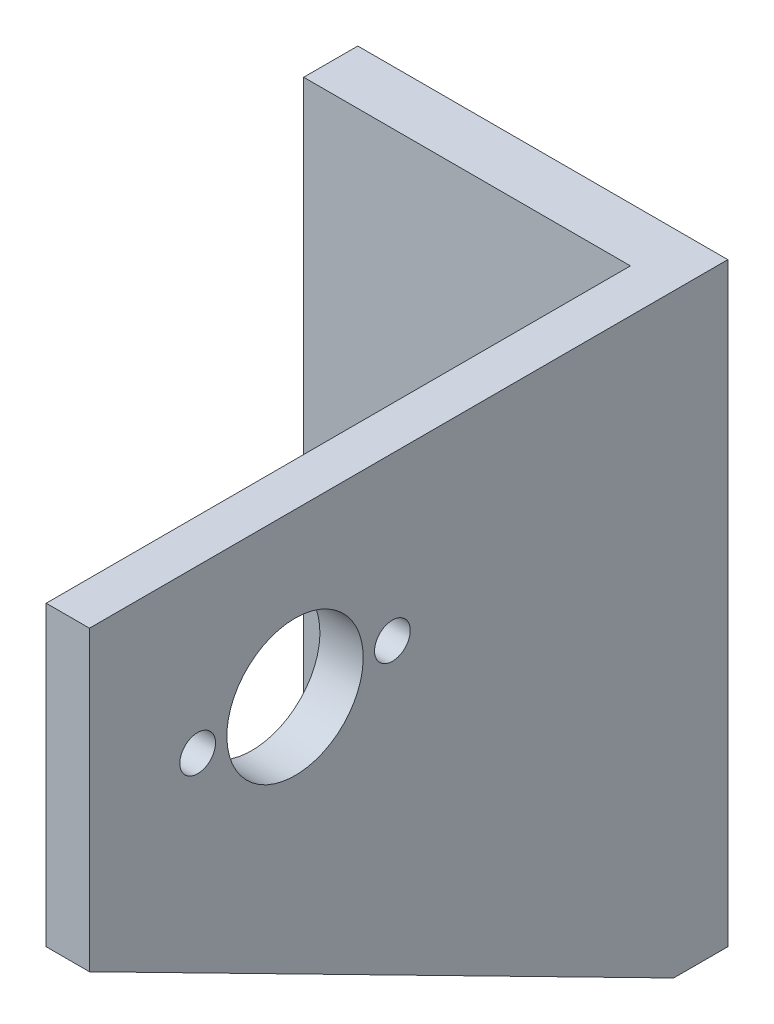
ISO-10303-21;
HEADER;
FILE_DESCRIPTION(('STEP AP214'),'2;1');
FILE_NAME('part.step','',(''),(''),'','','');
FILE_SCHEMA(('AUTOMOTIVE_DESIGN { 1 0 10303 214 1 1 1 1 }'));
ENDSEC;
DATA;
#1=APPLICATION_CONTEXT('core data for automotive mechanical design processes');
#2=APPLICATION_PROTOCOL_DEFINITION('international standard','automotive_design',2000,#1);
#3=PRODUCT_CONTEXT('',#1,'mechanical');
#4=PRODUCT('Part','Part','',(#3));
#5=PRODUCT_RELATED_PRODUCT_CATEGORY('part','',(#4));
#6=PRODUCT_DEFINITION_FORMATION('','',#4);
#7=PRODUCT_DEFINITION_CONTEXT('part definition',#1,'design');
#8=PRODUCT_DEFINITION('design','',#6,#7);
#9=PRODUCT_DEFINITION_SHAPE('','',#8);
#10=(LENGTH_UNIT() NAMED_UNIT(*) SI_UNIT(.MILLI.,.METRE.));
#11=(NAMED_UNIT(*) PLANE_ANGLE_UNIT() SI_UNIT($,.RADIAN.));
#12=(NAMED_UNIT(*) SI_UNIT($,.STERADIAN.) SOLID_ANGLE_UNIT());
#13=UNCERTAINTY_MEASURE_WITH_UNIT(LENGTH_MEASURE(1.E-05),#10,'distance_accuracy_value','');
#14=(GEOMETRIC_REPRESENTATION_CONTEXT(3) GLOBAL_UNCERTAINTY_ASSIGNED_CONTEXT((#13)) GLOBAL_UNIT_ASSIGNED_CONTEXT((#10,
#11,#12)) REPRESENTATION_CONTEXT('',''));
#15=CARTESIAN_POINT('',(0.,0.,0.));
#16=DIRECTION('',(0.,0.,1.));
#17=DIRECTION('',(1.,0.,0.));
#18=AXIS2_PLACEMENT_3D('',#15,#16,#17);
#19=CARTESIAN_POINT('',(18.6,0.,5.));
#20=DIRECTION('',(1.,0.,0.));
#21=DIRECTION('',(0.,1.,0.));
#22=AXIS2_PLACEMENT_3D('',#19,#20,#21);
#23=PLANE('',#22);
#24=CARTESIAN_POINT('',(18.6,20.,31.));
#25=DIRECTION('',(1.,0.,0.));
#26=DIRECTION('',(0.,1.,0.));
#27=AXIS2_PLACEMENT_3D('',#24,#25,#26);
#28=CIRCLE('',#27,1.65);
#29=CARTESIAN_POINT('',(18.6,21.65,31.));
#30=VERTEX_POINT('',#29);
#31=EDGE_CURVE('E176',#30,#30,#28,.F.);
#32=ORIENTED_EDGE('',*,*,#31,.T.);
#33=EDGE_LOOP('',(#32));
#34=FACE_BOUND('',#33,.T.);
#35=CARTESIAN_POINT('',(18.6,20.,40.));
#36=DIRECTION('',(1.,0.,0.));
#37=DIRECTION('',(0.,1.,0.));
#38=AXIS2_PLACEMENT_3D('',#35,#36,#37);
#39=CIRCLE('',#38,6.3);
#40=CARTESIAN_POINT('',(18.6,26.3,40.));
#41=VERTEX_POINT('',#40);
#42=EDGE_CURVE('E166',#41,#41,#39,.F.);
#43=ORIENTED_EDGE('',*,*,#42,.T.);
#44=EDGE_LOOP('',(#43));
#45=FACE_BOUND('',#44,.T.);
#46=CARTESIAN_POINT('',(18.6,20.,49.));
#47=DIRECTION('',(1.,0.,0.));
#48=DIRECTION('',(0.,1.,0.));
#49=AXIS2_PLACEMENT_3D('',#46,#47,#48);
#50=CIRCLE('',#49,1.65);
#51=CARTESIAN_POINT('',(18.6,21.65,49.));
#52=VERTEX_POINT('',#51);
#53=EDGE_CURVE('E163',#52,#52,#50,.F.);
#54=ORIENTED_EDGE('',*,*,#53,.T.);
#55=EDGE_LOOP('',(#54));
#56=FACE_BOUND('',#55,.T.);
#57=DIRECTION('',(0.,0.453802176068411,0.891102454825243));
#58=VECTOR('',#57,1.);
#59=CARTESIAN_POINT('',(18.6,-15.8812716999115,13.087684661992));
#60=LINE('',#59,#58);
#61=CARTESIAN_POINT('',(18.6,-20.,5.));
#62=VERTEX_POINT('',#61);
#63=CARTESIAN_POINT('',(18.6,7.5,59.));
#64=VERTEX_POINT('',#63);
#65=EDGE_CURVE('E52',#62,#64,#60,.T.);
#66=ORIENTED_EDGE('',*,*,#65,.F.);
#67=DIRECTION('',(0.,0.,-1.));
#68=VECTOR('',#67,1.);
#69=CARTESIAN_POINT('',(18.6,-20.,5.));
#70=LINE('',#69,#68);
#71=CARTESIAN_POINT('',(18.6,-20.,0.));
#72=VERTEX_POINT('',#71);
#73=EDGE_CURVE('E135',#62,#72,#70,.T.);
#74=ORIENTED_EDGE('',*,*,#73,.T.);
#75=DIRECTION('',(0.,-1.,0.));
#76=VECTOR('',#75,1.);
#77=CARTESIAN_POINT('',(18.6,0.,0.));
#78=LINE('',#77,#76);
#79=CARTESIAN_POINT('',(18.6,35.,0.));
#80=VERTEX_POINT('',#79);
#81=EDGE_CURVE('E118',#80,#72,#78,.T.);
#82=ORIENTED_EDGE('',*,*,#81,.F.);
#83=DIRECTION('',(0.,0.,-1.));
#84=VECTOR('',#83,1.);
#85=CARTESIAN_POINT('',(18.6,35.,5.));
#86=LINE('',#85,#84);
#87=CARTESIAN_POINT('',(18.6,35.,59.));
#88=VERTEX_POINT('',#87);
#89=EDGE_CURVE('E45',#88,#80,#86,.T.);
#90=ORIENTED_EDGE('',*,*,#89,.F.);
#91=DIRECTION('',(0.,1.,0.));
#92=VECTOR('',#91,1.);
#93=CARTESIAN_POINT('',(18.6,35.,59.));
#94=LINE('',#93,#92);
#95=EDGE_CURVE('E109',#64,#88,#94,.T.);
#96=ORIENTED_EDGE('',*,*,#95,.F.);
#97=EDGE_LOOP('',(#66,#74,#82,#90,#96));
#98=FACE_BOUND('',#97,.T.);
#99=ADVANCED_FACE('F37',(#34,#45,#56,#98),#23,.T.);
#100=CARTESIAN_POINT('',(0.,35.,5.));
#101=DIRECTION('',(0.,-1.,0.));
#102=DIRECTION('',(1.,0.,0.));
#103=AXIS2_PLACEMENT_3D('',#100,#101,#102);
#104=PLANE('',#103);
#105=DIRECTION('',(-1.,0.,0.));
#106=VECTOR('',#105,1.);
#107=CARTESIAN_POINT('',(0.,35.,0.));
#108=LINE('',#107,#106);
#109=CARTESIAN_POINT('',(-15.6000000000001,35.,0.));
#110=VERTEX_POINT('',#109);
#111=EDGE_CURVE('E138',#80,#110,#108,.T.);
#112=ORIENTED_EDGE('',*,*,#111,.T.);
#113=DIRECTION('',(0.,0.,-1.));
#114=VECTOR('',#113,1.);
#115=CARTESIAN_POINT('',(-15.6000000000001,35.,5.));
#116=LINE('',#115,#114);
#117=CARTESIAN_POINT('',(-15.6000000000001,35.,5.));
#118=VERTEX_POINT('',#117);
#119=EDGE_CURVE('E157',#118,#110,#116,.T.);
#120=ORIENTED_EDGE('',*,*,#119,.F.);
#121=DIRECTION('',(-1.,0.,0.));
#122=VECTOR('',#121,1.);
#123=CARTESIAN_POINT('',(0.,35.,5.));
#124=LINE('',#123,#122);
#125=CARTESIAN_POINT('',(14.6,35.,5.));
#126=VERTEX_POINT('',#125);
#127=EDGE_CURVE('E119',#126,#118,#124,.T.);
#128=ORIENTED_EDGE('',*,*,#127,.F.);
#129=DIRECTION('',(0.,0.,-1.));
#130=VECTOR('',#129,1.);
#131=CARTESIAN_POINT('',(14.6,35.,59.));
#132=LINE('',#131,#130);
#133=CARTESIAN_POINT('',(14.6,35.,59.));
#134=VERTEX_POINT('',#133);
#135=EDGE_CURVE('E111',#134,#126,#132,.T.);
#136=ORIENTED_EDGE('',*,*,#135,.F.);
#137=DIRECTION('',(-1.,0.,0.));
#138=VECTOR('',#137,1.);
#139=CARTESIAN_POINT('',(18.6,35.,59.));
#140=LINE('',#139,#138);
#141=EDGE_CURVE('E107',#88,#134,#140,.T.);
#142=ORIENTED_EDGE('',*,*,#141,.F.);
#143=ORIENTED_EDGE('',*,*,#89,.T.);
#144=EDGE_LOOP('',(#112,#120,#128,#136,#142,#143));
#145=FACE_BOUND('',#144,.T.);
#146=ADVANCED_FACE('F188',(#145),#104,.F.);
#147=CARTESIAN_POINT('',(-15.6000000000001,0.,5.));
#148=DIRECTION('',(1.,0.,0.));
#149=DIRECTION('',(0.,0.,-1.));
#150=AXIS2_PLACEMENT_3D('',#147,#148,#149);
#151=PLANE('',#150);
#152=DIRECTION('',(0.,-1.,0.));
#153=VECTOR('',#152,1.);
#154=CARTESIAN_POINT('',(-15.6000000000001,0.,0.));
#155=LINE('',#154,#153);
#156=CARTESIAN_POINT('',(-15.6,-20.,0.));
#157=VERTEX_POINT('',#156);
#158=EDGE_CURVE('E140',#110,#157,#155,.T.);
#159=ORIENTED_EDGE('',*,*,#158,.T.);
#160=DIRECTION('',(0.,0.,-1.));
#161=VECTOR('',#160,1.);
#162=CARTESIAN_POINT('',(-15.6,-20.,5.));
#163=LINE('',#162,#161);
#164=CARTESIAN_POINT('',(-15.6,-20.,5.));
#165=VERTEX_POINT('',#164);
#166=EDGE_CURVE('E154',#165,#157,#163,.T.);
#167=ORIENTED_EDGE('',*,*,#166,.F.);
#168=DIRECTION('',(0.,-1.,0.));
#169=VECTOR('',#168,1.);
#170=CARTESIAN_POINT('',(-15.6000000000001,0.,5.));
#171=LINE('',#170,#169);
#172=EDGE_CURVE('E121',#118,#165,#171,.T.);
#173=ORIENTED_EDGE('',*,*,#172,.F.);
#174=ORIENTED_EDGE('',*,*,#119,.T.);
#175=EDGE_LOOP('',(#159,#167,#173,#174));
#176=FACE_BOUND('',#175,.T.);
#177=ADVANCED_FACE('F195',(#176),#151,.F.);
#178=CARTESIAN_POINT('',(-9.,-5.,5.));
#179=DIRECTION('',(0.,0.,-1.));
#180=DIRECTION('',(-1.,0.,0.));
#181=AXIS2_PLACEMENT_3D('',#178,#179,#180);
#182=CYLINDRICAL_SURFACE('',#181,1.65);
#183=CARTESIAN_POINT('',(-9.,-5.,5.));
#184=DIRECTION('',(0.,0.,1.));
#185=DIRECTION('',(1.,0.,0.));
#186=AXIS2_PLACEMENT_3D('',#183,#184,#185);
#187=CIRCLE('',#186,1.65);
#188=CARTESIAN_POINT('',(-7.35,-5.,5.));
#189=VERTEX_POINT('',#188);
#190=EDGE_CURVE('E129',#189,#189,#187,.T.);
#191=ORIENTED_EDGE('',*,*,#190,.T.);
#192=EDGE_LOOP('',(#191));
#193=FACE_BOUND('',#192,.T.);
#194=CARTESIAN_POINT('',(-9.,-5.,0.));
#195=DIRECTION('',(0.,0.,1.));
#196=DIRECTION('',(1.,0.,0.));
#197=AXIS2_PLACEMENT_3D('',#194,#195,#196);
#198=CIRCLE('',#197,1.65);
#199=CARTESIAN_POINT('',(-7.35,-5.,0.));
#200=VERTEX_POINT('',#199);
#201=EDGE_CURVE('E148',#200,#200,#198,.T.);
#202=ORIENTED_EDGE('',*,*,#201,.F.);
#203=EDGE_LOOP('',(#202));
#204=FACE_BOUND('',#203,.T.);
#205=ADVANCED_FACE('F337',(#193,#204),#182,.F.);
#206=CARTESIAN_POINT('',(0.,-5.,5.));
#207=DIRECTION('',(0.,0.,-1.));
#208=DIRECTION('',(-1.,0.,0.));
#209=AXIS2_PLACEMENT_3D('',#206,#207,#208);
#210=CYLINDRICAL_SURFACE('',#209,6.3);
#211=CARTESIAN_POINT('',(0.,-5.,5.));
#212=DIRECTION('',(0.,0.,1.));
#213=DIRECTION('',(1.,0.,0.));
#214=AXIS2_PLACEMENT_3D('',#211,#212,#213);
#215=CIRCLE('',#214,6.3);
#216=CARTESIAN_POINT('',(6.3,-5.,5.));
#217=VERTEX_POINT('',#216);
#218=EDGE_CURVE('E126',#217,#217,#215,.T.);
#219=ORIENTED_EDGE('',*,*,#218,.T.);
#220=EDGE_LOOP('',(#219));
#221=FACE_BOUND('',#220,.T.);
#222=CARTESIAN_POINT('',(0.,-5.,0.));
#223=DIRECTION('',(0.,0.,1.));
#224=DIRECTION('',(1.,0.,0.));
#225=AXIS2_PLACEMENT_3D('',#222,#223,#224);
#226=CIRCLE('',#225,6.3);
#227=CARTESIAN_POINT('',(6.3,-5.,0.));
#228=VERTEX_POINT('',#227);
#229=EDGE_CURVE('E145',#228,#228,#226,.T.);
#230=ORIENTED_EDGE('',*,*,#229,.F.);
#231=EDGE_LOOP('',(#230));
#232=FACE_BOUND('',#231,.T.);
#233=ADVANCED_FACE('F218',(#221,#232),#210,.F.);
#234=CARTESIAN_POINT('',(0.,-20.,5.));
#235=DIRECTION('',(0.,1.,0.));
#236=DIRECTION('',(0.,0.,1.));
#237=AXIS2_PLACEMENT_3D('',#234,#235,#236);
#238=PLANE('',#237);
#239=ORIENTED_EDGE('',*,*,#73,.F.);
#240=DIRECTION('',(-1.,0.,0.));
#241=VECTOR('',#240,1.);
#242=CARTESIAN_POINT('',(54.,-20.,5.));
#243=LINE('',#242,#241);
#244=CARTESIAN_POINT('',(14.6,-20.,5.));
#245=VERTEX_POINT('',#244);
#246=EDGE_CURVE('E103',#62,#245,#243,.T.);
#247=ORIENTED_EDGE('',*,*,#246,.T.);
#248=DIRECTION('',(1.,0.,0.));
#249=VECTOR('',#248,1.);
#250=CARTESIAN_POINT('',(0.,-20.,5.));
#251=LINE('',#250,#249);
#252=EDGE_CURVE('E124',#165,#245,#251,.T.);
#253=ORIENTED_EDGE('',*,*,#252,.F.);
#254=ORIENTED_EDGE('',*,*,#166,.T.);
#255=DIRECTION('',(1.,0.,0.));
#256=VECTOR('',#255,1.);
#257=CARTESIAN_POINT('',(0.,-20.,0.));
#258=LINE('',#257,#256);
#259=EDGE_CURVE('E142',#157,#72,#258,.T.);
#260=ORIENTED_EDGE('',*,*,#259,.T.);
#261=EDGE_LOOP('',(#239,#247,#253,#254,#260));
#262=FACE_BOUND('',#261,.T.);
#263=ADVANCED_FACE('F182',(#262),#238,.F.);
#264=CARTESIAN_POINT('',(9.,-5.,5.));
#265=DIRECTION('',(0.,0.,-1.));
#266=DIRECTION('',(-1.,0.,0.));
#267=AXIS2_PLACEMENT_3D('',#264,#265,#266);
#268=CYLINDRICAL_SURFACE('',#267,1.65);
#269=CARTESIAN_POINT('',(9.,-5.,5.));
#270=DIRECTION('',(0.,0.,1.));
#271=DIRECTION('',(1.,0.,0.));
#272=AXIS2_PLACEMENT_3D('',#269,#270,#271);
#273=CIRCLE('',#272,1.65);
#274=CARTESIAN_POINT('',(10.65,-5.,5.));
#275=VERTEX_POINT('',#274);
#276=EDGE_CURVE('E132',#275,#275,#273,.T.);
#277=ORIENTED_EDGE('',*,*,#276,.T.);
#278=EDGE_LOOP('',(#277));
#279=FACE_BOUND('',#278,.T.);
#280=CARTESIAN_POINT('',(9.,-5.,0.));
#281=DIRECTION('',(0.,0.,1.));
#282=DIRECTION('',(1.,0.,0.));
#283=AXIS2_PLACEMENT_3D('',#280,#281,#282);
#284=CIRCLE('',#283,1.65);
#285=CARTESIAN_POINT('',(10.65,-5.,0.));
#286=VERTEX_POINT('',#285);
#287=EDGE_CURVE('E122',#286,#286,#284,.T.);
#288=ORIENTED_EDGE('',*,*,#287,.F.);
#289=EDGE_LOOP('',(#288));
#290=FACE_BOUND('',#289,.T.);
#291=ADVANCED_FACE('F209',(#279,#290),#268,.F.);
#292=CARTESIAN_POINT('',(0.,0.,5.));
#293=DIRECTION('',(0.,0.,1.));
#294=DIRECTION('',(1.,0.,0.));
#295=AXIS2_PLACEMENT_3D('',#292,#293,#294);
#296=PLANE('',#295);
#297=DIRECTION('',(0.,-1.,0.));
#298=VECTOR('',#297,1.);
#299=CARTESIAN_POINT('',(14.6,35.,5.));
#300=LINE('',#299,#298);
#301=EDGE_CURVE('E60',#126,#245,#300,.T.);
#302=ORIENTED_EDGE('',*,*,#301,.F.);
#303=ORIENTED_EDGE('',*,*,#127,.T.);
#304=ORIENTED_EDGE('',*,*,#172,.T.);
#305=ORIENTED_EDGE('',*,*,#252,.T.);
#306=EDGE_LOOP('',(#302,#303,#304,#305));
#307=FACE_BOUND('',#306,.T.);
#308=ORIENTED_EDGE('',*,*,#218,.F.);
#309=EDGE_LOOP('',(#308));
#310=FACE_BOUND('',#309,.T.);
#311=ORIENTED_EDGE('',*,*,#190,.F.);
#312=EDGE_LOOP('',(#311));
#313=FACE_BOUND('',#312,.T.);
#314=ORIENTED_EDGE('',*,*,#276,.F.);
#315=EDGE_LOOP('',(#314));
#316=FACE_BOUND('',#315,.T.);
#317=ADVANCED_FACE('F191',(#307,#310,#313,#316),#296,.T.);
#318=CARTESIAN_POINT('',(0.,0.,0.));
#319=DIRECTION('',(0.,0.,1.));
#320=DIRECTION('',(1.,0.,0.));
#321=AXIS2_PLACEMENT_3D('',#318,#319,#320);
#322=PLANE('',#321);
#323=ORIENTED_EDGE('',*,*,#81,.T.);
#324=ORIENTED_EDGE('',*,*,#259,.F.);
#325=ORIENTED_EDGE('',*,*,#158,.F.);
#326=ORIENTED_EDGE('',*,*,#111,.F.);
#327=EDGE_LOOP('',(#323,#324,#325,#326));
#328=FACE_BOUND('',#327,.T.);
#329=ORIENTED_EDGE('',*,*,#229,.T.);
#330=EDGE_LOOP('',(#329));
#331=FACE_BOUND('',#330,.T.);
#332=ORIENTED_EDGE('',*,*,#201,.T.);
#333=EDGE_LOOP('',(#332));
#334=FACE_BOUND('',#333,.T.);
#335=ORIENTED_EDGE('',*,*,#287,.T.);
#336=EDGE_LOOP('',(#335));
#337=FACE_BOUND('',#336,.T.);
#338=ADVANCED_FACE('F199',(#328,#331,#334,#337),#322,.F.);
#339=CARTESIAN_POINT('',(14.6,35.,59.));
#340=DIRECTION('',(1.,0.,0.));
#341=DIRECTION('',(0.,1.,0.));
#342=AXIS2_PLACEMENT_3D('',#339,#340,#341);
#343=PLANE('',#342);
#344=CARTESIAN_POINT('',(14.6,20.,31.));
#345=DIRECTION('',(1.,0.,0.));
#346=DIRECTION('',(0.,1.,0.));
#347=AXIS2_PLACEMENT_3D('',#344,#345,#346);
#348=CIRCLE('',#347,1.65);
#349=CARTESIAN_POINT('',(14.6,21.65,31.));
#350=VERTEX_POINT('',#349);
#351=EDGE_CURVE('E40',#350,#350,#348,.F.);
#352=ORIENTED_EDGE('',*,*,#351,.F.);
#353=EDGE_LOOP('',(#352));
#354=FACE_BOUND('',#353,.T.);
#355=CARTESIAN_POINT('',(14.6,20.,40.));
#356=DIRECTION('',(1.,0.,0.));
#357=DIRECTION('',(0.,1.,0.));
#358=AXIS2_PLACEMENT_3D('',#355,#356,#357);
#359=CIRCLE('',#358,6.3);
#360=CARTESIAN_POINT('',(14.6,26.3,40.));
#361=VERTEX_POINT('',#360);
#362=EDGE_CURVE('E164',#361,#361,#359,.F.);
#363=ORIENTED_EDGE('',*,*,#362,.F.);
#364=EDGE_LOOP('',(#363));
#365=FACE_BOUND('',#364,.T.);
#366=CARTESIAN_POINT('',(14.6,20.,49.));
#367=DIRECTION('',(1.,0.,0.));
#368=DIRECTION('',(0.,1.,0.));
#369=AXIS2_PLACEMENT_3D('',#366,#367,#368);
#370=CIRCLE('',#369,1.65);
#371=CARTESIAN_POINT('',(14.6,21.65,49.));
#372=VERTEX_POINT('',#371);
#373=EDGE_CURVE('E161',#372,#372,#370,.F.);
#374=ORIENTED_EDGE('',*,*,#373,.F.);
#375=EDGE_LOOP('',(#374));
#376=FACE_BOUND('',#375,.T.);
#377=ORIENTED_EDGE('',*,*,#301,.T.);
#378=DIRECTION('',(0.,0.453802176068411,0.891102454825243));
#379=VECTOR('',#378,1.);
#380=CARTESIAN_POINT('',(14.6,13.1632514126217,70.120566410239));
#381=LINE('',#380,#379);
#382=CARTESIAN_POINT('',(14.6,7.5,59.));
#383=VERTEX_POINT('',#382);
#384=EDGE_CURVE('E93',#245,#383,#381,.T.);
#385=ORIENTED_EDGE('',*,*,#384,.T.);
#386=DIRECTION('',(0.,-1.,0.));
#387=VECTOR('',#386,1.);
#388=CARTESIAN_POINT('',(14.6,35.,59.));
#389=LINE('',#388,#387);
#390=EDGE_CURVE('E101',#134,#383,#389,.T.);
#391=ORIENTED_EDGE('',*,*,#390,.F.);
#392=ORIENTED_EDGE('',*,*,#135,.T.);
#393=EDGE_LOOP('',(#377,#385,#391,#392));
#394=FACE_BOUND('',#393,.T.);
#395=ADVANCED_FACE('F99',(#354,#365,#376,#394),#343,.F.);
#396=CARTESIAN_POINT('',(0.,0.,59.));
#397=DIRECTION('',(0.,0.,1.));
#398=DIRECTION('',(1.,0.,0.));
#399=AXIS2_PLACEMENT_3D('',#396,#397,#398);
#400=PLANE('',#399);
#401=DIRECTION('',(-1.,0.,0.));
#402=VECTOR('',#401,1.);
#403=CARTESIAN_POINT('',(0.,7.5,59.));
#404=LINE('',#403,#402);
#405=EDGE_CURVE('E11',#64,#383,#404,.T.);
#406=ORIENTED_EDGE('',*,*,#405,.F.);
#407=ORIENTED_EDGE('',*,*,#95,.T.);
#408=ORIENTED_EDGE('',*,*,#141,.T.);
#409=ORIENTED_EDGE('',*,*,#390,.T.);
#410=EDGE_LOOP('',(#406,#407,#408,#409));
#411=FACE_BOUND('',#410,.T.);
#412=ADVANCED_FACE('F105',(#411),#400,.T.);
#413=CARTESIAN_POINT('',(54.,-17.9031928654095,9.11736673701409));
#414=DIRECTION('',(0.,0.891102454825243,-0.453802176068411));
#415=DIRECTION('',(0.,0.453802176068411,0.891102454825243));
#416=AXIS2_PLACEMENT_3D('',#413,#414,#415);
#417=PLANE('',#416);
#418=ORIENTED_EDGE('',*,*,#65,.T.);
#419=ORIENTED_EDGE('',*,*,#405,.T.);
#420=ORIENTED_EDGE('',*,*,#384,.F.);
#421=ORIENTED_EDGE('',*,*,#246,.F.);
#422=EDGE_LOOP('',(#418,#419,#420,#421));
#423=FACE_BOUND('',#422,.T.);
#424=ADVANCED_FACE('F92',(#423),#417,.F.);
#425=CARTESIAN_POINT('',(54.,20.,49.));
#426=DIRECTION('',(-1.,0.,0.));
#427=DIRECTION('',(0.,0.,1.));
#428=AXIS2_PLACEMENT_3D('',#425,#426,#427);
#429=CYLINDRICAL_SURFACE('',#428,1.65);
#430=ORIENTED_EDGE('',*,*,#53,.F.);
#431=EDGE_LOOP('',(#430));
#432=FACE_BOUND('',#431,.T.);
#433=ORIENTED_EDGE('',*,*,#373,.T.);
#434=EDGE_LOOP('',(#433));
#435=FACE_BOUND('',#434,.T.);
#436=ADVANCED_FACE('F233',(#432,#435),#429,.F.);
#437=CARTESIAN_POINT('',(54.,20.,40.));
#438=DIRECTION('',(-1.,0.,0.));
#439=DIRECTION('',(0.,0.,1.));
#440=AXIS2_PLACEMENT_3D('',#437,#438,#439);
#441=CYLINDRICAL_SURFACE('',#440,6.3);
#442=ORIENTED_EDGE('',*,*,#42,.F.);
#443=EDGE_LOOP('',(#442));
#444=FACE_BOUND('',#443,.T.);
#445=ORIENTED_EDGE('',*,*,#362,.T.);
#446=EDGE_LOOP('',(#445));
#447=FACE_BOUND('',#446,.T.);
#448=ADVANCED_FACE('F230',(#444,#447),#441,.F.);
#449=CARTESIAN_POINT('',(54.,20.,31.));
#450=DIRECTION('',(-1.,0.,0.));
#451=DIRECTION('',(0.,0.,1.));
#452=AXIS2_PLACEMENT_3D('',#449,#450,#451);
#453=CYLINDRICAL_SURFACE('',#452,1.65);
#454=ORIENTED_EDGE('',*,*,#31,.F.);
#455=EDGE_LOOP('',(#454));
#456=FACE_BOUND('',#455,.T.);
#457=ORIENTED_EDGE('',*,*,#351,.T.);
#458=EDGE_LOOP('',(#457));
#459=FACE_BOUND('',#458,.T.);
#460=ADVANCED_FACE('F232',(#456,#459),#453,.F.);
#461=CLOSED_SHELL('',(#99,#146,#177,#205,#233,#263,#291,#317,#338,#395,#412,#424,#436,#448,#460));
#462=MANIFOLD_SOLID_BREP('B2',#461);
#463=ADVANCED_BREP_SHAPE_REPRESENTATION('',(#18,#462),#14);
#464=SHAPE_DEFINITION_REPRESENTATION(#9,#463);
ENDSEC;
END-ISO-10303-21;
